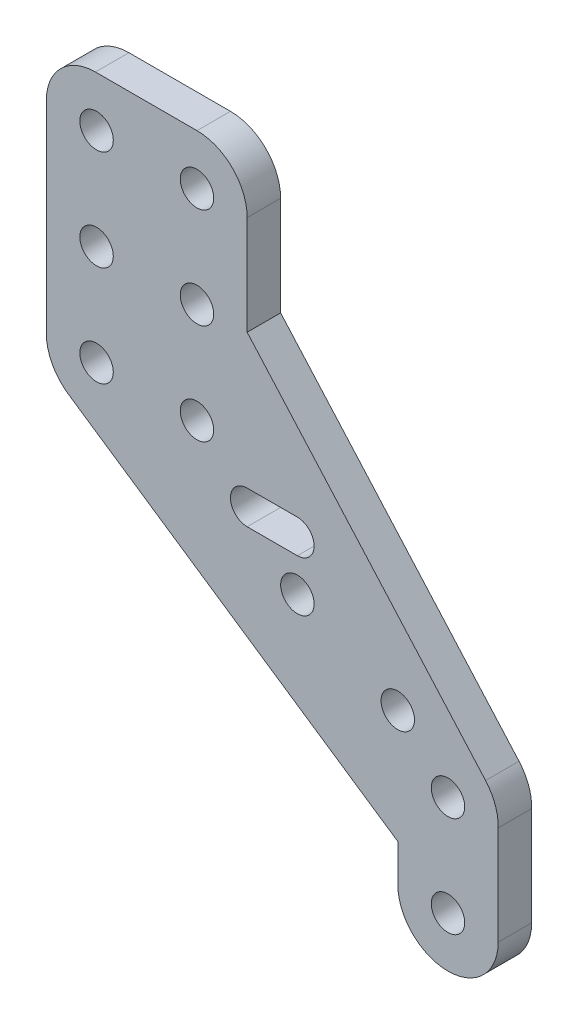
ISO-10303-21;
HEADER;
FILE_DESCRIPTION(('STEP AP214'),'2;1');
FILE_NAME('part.step','',(''),(''),'','','');
FILE_SCHEMA(('AUTOMOTIVE_DESIGN { 1 0 10303 214 1 1 1 1 }'));
ENDSEC;
DATA;
#1=APPLICATION_CONTEXT('core data for automotive mechanical design processes');
#2=APPLICATION_PROTOCOL_DEFINITION('international standard','automotive_design',2000,#1);
#3=PRODUCT_CONTEXT('',#1,'mechanical');
#4=PRODUCT('Part','Part','',(#3));
#5=PRODUCT_RELATED_PRODUCT_CATEGORY('part','',(#4));
#6=PRODUCT_DEFINITION_FORMATION('','',#4);
#7=PRODUCT_DEFINITION_CONTEXT('part definition',#1,'design');
#8=PRODUCT_DEFINITION('design','',#6,#7);
#9=PRODUCT_DEFINITION_SHAPE('','',#8);
#10=(LENGTH_UNIT() NAMED_UNIT(*) SI_UNIT(.MILLI.,.METRE.));
#11=(NAMED_UNIT(*) PLANE_ANGLE_UNIT() SI_UNIT($,.RADIAN.));
#12=(NAMED_UNIT(*) SI_UNIT($,.STERADIAN.) SOLID_ANGLE_UNIT());
#13=UNCERTAINTY_MEASURE_WITH_UNIT(LENGTH_MEASURE(1.E-05),#10,'distance_accuracy_value','');
#14=(GEOMETRIC_REPRESENTATION_CONTEXT(3) GLOBAL_UNCERTAINTY_ASSIGNED_CONTEXT((#13)) GLOBAL_UNIT_ASSIGNED_CONTEXT((#10,
#11,#12)) REPRESENTATION_CONTEXT('',''));
#15=CARTESIAN_POINT('',(0.,0.,0.));
#16=DIRECTION('',(0.,0.,1.));
#17=DIRECTION('',(1.,0.,0.));
#18=AXIS2_PLACEMENT_3D('',#15,#16,#17);
#19=CARTESIAN_POINT('',(79.4565649359122,0.,3.));
#20=DIRECTION('',(-1.,0.,0.));
#21=DIRECTION('',(0.,0.,1.));
#22=AXIS2_PLACEMENT_3D('',#19,#20,#21);
#23=PLANE('',#22);
#24=DIRECTION('',(0.,1.,0.));
#25=VECTOR('',#24,1.);
#26=CARTESIAN_POINT('',(79.4565649359122,0.,0.));
#27=LINE('',#26,#25);
#28=CARTESIAN_POINT('',(79.4565649359122,249.316156902,0.));
#29=VERTEX_POINT('',#28);
#30=CARTESIAN_POINT('',(79.4565649359122,252.639142715618,0.));
#31=VERTEX_POINT('',#30);
#32=EDGE_CURVE('E230',#29,#31,#27,.T.);
#33=ORIENTED_EDGE('',*,*,#32,.F.);
#34=DIRECTION('',(0.,0.,-1.));
#35=VECTOR('',#34,1.);
#36=CARTESIAN_POINT('',(79.4565649359122,249.316156902,3.));
#37=LINE('',#36,#35);
#38=CARTESIAN_POINT('',(79.4565649359122,249.316156902,3.));
#39=VERTEX_POINT('',#38);
#40=EDGE_CURVE('E11',#39,#29,#37,.T.);
#41=ORIENTED_EDGE('',*,*,#40,.F.);
#42=DIRECTION('',(0.,1.,0.));
#43=VECTOR('',#42,1.);
#44=CARTESIAN_POINT('',(79.4565649359122,0.,3.));
#45=LINE('',#44,#43);
#46=CARTESIAN_POINT('',(79.4565649359122,252.639142715618,3.));
#47=VERTEX_POINT('',#46);
#48=EDGE_CURVE('E338',#39,#47,#45,.T.);
#49=ORIENTED_EDGE('',*,*,#48,.T.);
#50=DIRECTION('',(0.,0.,-1.));
#51=VECTOR('',#50,1.);
#52=CARTESIAN_POINT('',(79.4565649359122,252.639142715618,3.));
#53=LINE('',#52,#51);
#54=EDGE_CURVE('E113',#47,#31,#53,.T.);
#55=ORIENTED_EDGE('',*,*,#54,.T.);
#56=EDGE_LOOP('',(#33,#41,#49,#55));
#57=FACE_BOUND('',#56,.T.);
#58=ADVANCED_FACE('F35',(#57),#23,.T.);
#59=CARTESIAN_POINT('',(83.9565649359122,249.316156902,3.));
#60=DIRECTION('',(0.,0.,-1.));
#61=DIRECTION('',(-1.,0.,0.));
#62=AXIS2_PLACEMENT_3D('',#59,#60,#61);
#63=CYLINDRICAL_SURFACE('',#62,4.5);
#64=CARTESIAN_POINT('',(83.9565649359122,249.316156902,0.));
#65=DIRECTION('',(0.,0.,1.));
#66=DIRECTION('',(1.,0.,0.));
#67=AXIS2_PLACEMENT_3D('',#64,#65,#66);
#68=CIRCLE('',#67,4.5);
#69=CARTESIAN_POINT('',(88.4565649359,249.316156902,0.));
#70=VERTEX_POINT('',#69);
#71=EDGE_CURVE('E232',#29,#70,#68,.T.);
#72=ORIENTED_EDGE('',*,*,#71,.T.);
#73=DIRECTION('',(0.,0.,-1.));
#74=VECTOR('',#73,1.);
#75=CARTESIAN_POINT('',(88.4565649359,249.316156902,3.));
#76=LINE('',#75,#74);
#77=CARTESIAN_POINT('',(88.4565649359,249.316156902,3.));
#78=VERTEX_POINT('',#77);
#79=EDGE_CURVE('E45',#78,#70,#76,.T.);
#80=ORIENTED_EDGE('',*,*,#79,.F.);
#81=CARTESIAN_POINT('',(83.9565649359122,249.316156902,3.));
#82=DIRECTION('',(0.,0.,1.));
#83=DIRECTION('',(1.,0.,0.));
#84=AXIS2_PLACEMENT_3D('',#81,#82,#83);
#85=CIRCLE('',#84,4.5);
#86=EDGE_CURVE('E340',#39,#78,#85,.T.);
#87=ORIENTED_EDGE('',*,*,#86,.F.);
#88=ORIENTED_EDGE('',*,*,#40,.T.);
#89=EDGE_LOOP('',(#72,#80,#87,#88));
#90=FACE_BOUND('',#89,.T.);
#91=ADVANCED_FACE('F377',(#90),#63,.T.);
#92=CARTESIAN_POINT('',(88.5141496779934,0.0204458570885828,3.));
#93=DIRECTION('',(0.99999997332188,0.000230989696195534,0.));
#94=DIRECTION('',(-0.000230989696195534,0.99999997332188,0.));
#95=AXIS2_PLACEMENT_3D('',#92,#93,#94);
#96=PLANE('',#95);
#97=DIRECTION('',(0.000230989696195534,-0.99999997332188,0.));
#98=VECTOR('',#97,1.);
#99=CARTESIAN_POINT('',(88.5141496779934,0.0204458570885828,0.));
#100=LINE('',#99,#98);
#101=CARTESIAN_POINT('',(88.4545173818,258.1804226208,0.));
#102=VERTEX_POINT('',#101);
#103=EDGE_CURVE('E235',#102,#70,#100,.T.);
#104=ORIENTED_EDGE('',*,*,#103,.F.);
#105=DIRECTION('',(0.,0.,-1.));
#106=VECTOR('',#105,1.);
#107=CARTESIAN_POINT('',(88.4545173818,258.1804226208,3.));
#108=LINE('',#107,#106);
#109=CARTESIAN_POINT('',(88.4545173818,258.1804226208,3.));
#110=VERTEX_POINT('',#109);
#111=EDGE_CURVE('E275',#110,#102,#108,.T.);
#112=ORIENTED_EDGE('',*,*,#111,.F.);
#113=DIRECTION('',(0.000230989696195534,-0.99999997332188,0.));
#114=VECTOR('',#113,1.);
#115=CARTESIAN_POINT('',(88.5141496779934,0.0204458570885828,3.));
#116=LINE('',#115,#114);
#117=EDGE_CURVE('E342',#110,#78,#116,.T.);
#118=ORIENTED_EDGE('',*,*,#117,.T.);
#119=ORIENTED_EDGE('',*,*,#79,.T.);
#120=EDGE_LOOP('',(#104,#112,#118,#119));
#121=FACE_BOUND('',#120,.T.);
#122=ADVANCED_FACE('F382',(#121),#96,.T.);
#123=CARTESIAN_POINT('',(83.9565649359758,258.316156902041,3.));
#124=DIRECTION('',(0.,0.,-1.));
#125=DIRECTION('',(-1.,0.,0.));
#126=AXIS2_PLACEMENT_3D('',#123,#124,#125);
#127=CYLINDRICAL_SURFACE('',#126,4.50000000000001);
#128=CARTESIAN_POINT('',(83.9565649359758,258.316156902041,0.));
#129=DIRECTION('',(0.,0.,1.));
#130=DIRECTION('',(1.,0.,0.));
#131=AXIS2_PLACEMENT_3D('',#128,#129,#130);
#132=CIRCLE('',#131,4.50000000000001);
#133=CARTESIAN_POINT('',(87.3246253296,261.3004774587,0.));
#134=VERTEX_POINT('',#133);
#135=EDGE_CURVE('E238',#102,#134,#132,.T.);
#136=ORIENTED_EDGE('',*,*,#135,.T.);
#137=DIRECTION('',(0.,0.,-1.));
#138=VECTOR('',#137,1.);
#139=CARTESIAN_POINT('',(87.3246253296,261.3004774587,3.));
#140=LINE('',#139,#138);
#141=CARTESIAN_POINT('',(87.3246253296,261.3004774587,3.));
#142=VERTEX_POINT('',#141);
#143=EDGE_CURVE('E272',#142,#134,#140,.T.);
#144=ORIENTED_EDGE('',*,*,#143,.F.);
#145=CARTESIAN_POINT('',(83.9565649359758,258.316156902041,3.));
#146=DIRECTION('',(0.,0.,1.));
#147=DIRECTION('',(1.,0.,0.));
#148=AXIS2_PLACEMENT_3D('',#145,#146,#147);
#149=CIRCLE('',#148,4.50000000000001);
#150=EDGE_CURVE('E345',#110,#142,#149,.T.);
#151=ORIENTED_EDGE('',*,*,#150,.F.);
#152=ORIENTED_EDGE('',*,*,#111,.T.);
#153=EDGE_LOOP('',(#136,#144,#151,#152));
#154=FACE_BOUND('',#153,.T.);
#155=ADVANCED_FACE('F585',(#154),#127,.T.);
#156=CARTESIAN_POINT('',(178.61847131618,158.267582362266,3.));
#157=DIRECTION('',(-0.748457865249174,-0.663182345925047,0.));
#158=DIRECTION('',(0.663182345925047,-0.748457865249174,0.));
#159=AXIS2_PLACEMENT_3D('',#156,#157,#158);
#160=PLANE('',#159);
#161=DIRECTION('',(-0.663182345925047,0.748457865249174,0.));
#162=VECTOR('',#161,1.);
#163=CARTESIAN_POINT('',(178.61847131618,158.267582362266,0.));
#164=LINE('',#163,#162);
#165=CARTESIAN_POINT('',(65.9565649359,285.416156902,0.));
#166=VERTEX_POINT('',#165);
#167=EDGE_CURVE('E241',#134,#166,#164,.T.);
#168=ORIENTED_EDGE('',*,*,#167,.T.);
#169=DIRECTION('',(0.,0.,-1.));
#170=VECTOR('',#169,1.);
#171=CARTESIAN_POINT('',(65.9565649359,285.416156902,3.));
#172=LINE('',#171,#170);
#173=CARTESIAN_POINT('',(65.9565649359,285.416156902,3.));
#174=VERTEX_POINT('',#173);
#175=EDGE_CURVE('E270',#174,#166,#172,.T.);
#176=ORIENTED_EDGE('',*,*,#175,.F.);
#177=DIRECTION('',(-0.663182345925047,0.748457865249174,0.));
#178=VECTOR('',#177,1.);
#179=CARTESIAN_POINT('',(178.61847131618,158.267582362266,3.));
#180=LINE('',#179,#178);
#181=EDGE_CURVE('E348',#142,#174,#180,.T.);
#182=ORIENTED_EDGE('',*,*,#181,.F.);
#183=ORIENTED_EDGE('',*,*,#143,.T.);
#184=EDGE_LOOP('',(#168,#176,#182,#183));
#185=FACE_BOUND('',#184,.T.);
#186=ADVANCED_FACE('F576',(#185),#160,.F.);
#187=CARTESIAN_POINT('',(65.9565649359,0.,3.));
#188=DIRECTION('',(1.,0.,0.));
#189=DIRECTION('',(0.,0.,-1.));
#190=AXIS2_PLACEMENT_3D('',#187,#188,#189);
#191=PLANE('',#190);
#192=DIRECTION('',(0.,-1.,0.));
#193=VECTOR('',#192,1.);
#194=CARTESIAN_POINT('',(65.9565649359,0.,0.));
#195=LINE('',#194,#193);
#196=CARTESIAN_POINT('',(65.9565649359,294.316156902,0.));
#197=VERTEX_POINT('',#196);
#198=EDGE_CURVE('E244',#197,#166,#195,.T.);
#199=ORIENTED_EDGE('',*,*,#198,.F.);
#200=DIRECTION('',(0.,0.,-1.));
#201=VECTOR('',#200,1.);
#202=CARTESIAN_POINT('',(65.9565649359,294.316156902,3.));
#203=LINE('',#202,#201);
#204=CARTESIAN_POINT('',(65.9565649359,294.316156902,3.));
#205=VERTEX_POINT('',#204);
#206=EDGE_CURVE('E268',#205,#197,#203,.T.);
#207=ORIENTED_EDGE('',*,*,#206,.F.);
#208=DIRECTION('',(0.,-1.,0.));
#209=VECTOR('',#208,1.);
#210=CARTESIAN_POINT('',(65.9565649359,0.,3.));
#211=LINE('',#210,#209);
#212=EDGE_CURVE('E350',#205,#174,#211,.T.);
#213=ORIENTED_EDGE('',*,*,#212,.T.);
#214=ORIENTED_EDGE('',*,*,#175,.T.);
#215=EDGE_LOOP('',(#199,#207,#213,#214));
#216=FACE_BOUND('',#215,.T.);
#217=ADVANCED_FACE('F568',(#216),#191,.T.);
#218=CARTESIAN_POINT('',(61.4565649359,294.316156902,3.));
#219=DIRECTION('',(0.,0.,-1.));
#220=DIRECTION('',(-1.,0.,0.));
#221=AXIS2_PLACEMENT_3D('',#218,#219,#220);
#222=CYLINDRICAL_SURFACE('',#221,4.5);
#223=CARTESIAN_POINT('',(61.4565649359,294.316156902,0.));
#224=DIRECTION('',(0.,0.,1.));
#225=DIRECTION('',(1.,0.,0.));
#226=AXIS2_PLACEMENT_3D('',#223,#224,#225);
#227=CIRCLE('',#226,4.5);
#228=CARTESIAN_POINT('',(61.4565649359,298.816156902,0.));
#229=VERTEX_POINT('',#228);
#230=EDGE_CURVE('E247',#197,#229,#227,.T.);
#231=ORIENTED_EDGE('',*,*,#230,.T.);
#232=DIRECTION('',(0.,0.,-1.));
#233=VECTOR('',#232,1.);
#234=CARTESIAN_POINT('',(61.4565649359,298.816156902,3.));
#235=LINE('',#234,#233);
#236=CARTESIAN_POINT('',(61.4565649359,298.816156902,3.));
#237=VERTEX_POINT('',#236);
#238=EDGE_CURVE('E266',#237,#229,#235,.T.);
#239=ORIENTED_EDGE('',*,*,#238,.F.);
#240=CARTESIAN_POINT('',(61.4565649359,294.316156902,3.));
#241=DIRECTION('',(0.,0.,1.));
#242=DIRECTION('',(1.,0.,0.));
#243=AXIS2_PLACEMENT_3D('',#240,#241,#242);
#244=CIRCLE('',#243,4.5);
#245=EDGE_CURVE('E353',#205,#237,#244,.T.);
#246=ORIENTED_EDGE('',*,*,#245,.F.);
#247=ORIENTED_EDGE('',*,*,#206,.T.);
#248=EDGE_LOOP('',(#231,#239,#246,#247));
#249=FACE_BOUND('',#248,.T.);
#250=ADVANCED_FACE('F362',(#249),#222,.T.);
#251=CARTESIAN_POINT('',(0.,298.816156902,3.));
#252=DIRECTION('',(0.,1.,0.));
#253=DIRECTION('',(0.,0.,1.));
#254=AXIS2_PLACEMENT_3D('',#251,#252,#253);
#255=PLANE('',#254);
#256=DIRECTION('',(1.,0.,0.));
#257=VECTOR('',#256,1.);
#258=CARTESIAN_POINT('',(0.,298.816156902,0.));
#259=LINE('',#258,#257);
#260=CARTESIAN_POINT('',(52.3565649359,298.816156902,0.));
#261=VERTEX_POINT('',#260);
#262=EDGE_CURVE('E250',#261,#229,#259,.T.);
#263=ORIENTED_EDGE('',*,*,#262,.F.);
#264=DIRECTION('',(0.,0.,-1.));
#265=VECTOR('',#264,1.);
#266=CARTESIAN_POINT('',(52.3565649359,298.816156902,3.));
#267=LINE('',#266,#265);
#268=CARTESIAN_POINT('',(52.3565649359,298.816156902,3.));
#269=VERTEX_POINT('',#268);
#270=EDGE_CURVE('E264',#269,#261,#267,.T.);
#271=ORIENTED_EDGE('',*,*,#270,.F.);
#272=DIRECTION('',(1.,0.,0.));
#273=VECTOR('',#272,1.);
#274=CARTESIAN_POINT('',(0.,298.816156902,3.));
#275=LINE('',#274,#273);
#276=EDGE_CURVE('E182',#269,#237,#275,.T.);
#277=ORIENTED_EDGE('',*,*,#276,.T.);
#278=ORIENTED_EDGE('',*,*,#238,.T.);
#279=EDGE_LOOP('',(#263,#271,#277,#278));
#280=FACE_BOUND('',#279,.T.);
#281=ADVANCED_FACE('F357',(#280),#255,.T.);
#282=CARTESIAN_POINT('',(52.3565649359001,294.416156902,3.));
#283=DIRECTION('',(0.,0.,-1.));
#284=DIRECTION('',(-1.,0.,0.));
#285=AXIS2_PLACEMENT_3D('',#282,#283,#284);
#286=CYLINDRICAL_SURFACE('',#285,4.40000000000007);
#287=CARTESIAN_POINT('',(52.3565649359001,294.416156902,0.));
#288=DIRECTION('',(0.,0.,1.));
#289=DIRECTION('',(1.,0.,0.));
#290=AXIS2_PLACEMENT_3D('',#287,#288,#289);
#291=CIRCLE('',#290,4.40000000000007);
#292=CARTESIAN_POINT('',(47.9565649359,294.416156902,0.));
#293=VERTEX_POINT('',#292);
#294=EDGE_CURVE('E253',#261,#293,#291,.T.);
#295=ORIENTED_EDGE('',*,*,#294,.T.);
#296=DIRECTION('',(0.,0.,-1.));
#297=VECTOR('',#296,1.);
#298=CARTESIAN_POINT('',(47.9565649359,294.416156902,3.));
#299=LINE('',#298,#297);
#300=CARTESIAN_POINT('',(47.9565649359,294.416156902,3.));
#301=VERTEX_POINT('',#300);
#302=EDGE_CURVE('E169',#301,#293,#299,.T.);
#303=ORIENTED_EDGE('',*,*,#302,.F.);
#304=CARTESIAN_POINT('',(52.3565649359001,294.416156902,3.));
#305=DIRECTION('',(0.,0.,1.));
#306=DIRECTION('',(1.,0.,0.));
#307=AXIS2_PLACEMENT_3D('',#304,#305,#306);
#308=CIRCLE('',#307,4.40000000000007);
#309=EDGE_CURVE('E179',#269,#301,#308,.T.);
#310=ORIENTED_EDGE('',*,*,#309,.F.);
#311=ORIENTED_EDGE('',*,*,#270,.T.);
#312=EDGE_LOOP('',(#295,#303,#310,#311));
#313=FACE_BOUND('',#312,.T.);
#314=ADVANCED_FACE('F367',(#313),#286,.T.);
#315=CARTESIAN_POINT('',(47.9565649359,0.,3.));
#316=DIRECTION('',(-1.,0.,0.));
#317=DIRECTION('',(0.,0.,1.));
#318=AXIS2_PLACEMENT_3D('',#315,#316,#317);
#319=PLANE('',#318);
#320=DIRECTION('',(0.,1.,0.));
#321=VECTOR('',#320,1.);
#322=CARTESIAN_POINT('',(47.9565649359,0.,0.));
#323=LINE('',#322,#321);
#324=CARTESIAN_POINT('',(47.9565649359,276.316156902,0.));
#325=VERTEX_POINT('',#324);
#326=EDGE_CURVE('E166',#325,#293,#323,.T.);
#327=ORIENTED_EDGE('',*,*,#326,.F.);
#328=DIRECTION('',(0.,0.,-1.));
#329=VECTOR('',#328,1.);
#330=CARTESIAN_POINT('',(47.9565649359,276.316156902,3.));
#331=LINE('',#330,#329);
#332=CARTESIAN_POINT('',(47.9565649359,276.316156902,3.));
#333=VERTEX_POINT('',#332);
#334=EDGE_CURVE('E160',#333,#325,#331,.T.);
#335=ORIENTED_EDGE('',*,*,#334,.F.);
#336=DIRECTION('',(0.,1.,0.));
#337=VECTOR('',#336,1.);
#338=CARTESIAN_POINT('',(47.9565649359,0.,3.));
#339=LINE('',#338,#337);
#340=EDGE_CURVE('E164',#333,#301,#339,.T.);
#341=ORIENTED_EDGE('',*,*,#340,.T.);
#342=ORIENTED_EDGE('',*,*,#302,.T.);
#343=EDGE_LOOP('',(#327,#335,#341,#342));
#344=FACE_BOUND('',#343,.T.);
#345=ADVANCED_FACE('F162',(#344),#319,.T.);
#346=CARTESIAN_POINT('',(52.456564935914,276.316156902,3.));
#347=DIRECTION('',(0.,0.,-1.));
#348=DIRECTION('',(-1.,0.,0.));
#349=AXIS2_PLACEMENT_3D('',#346,#347,#348);
#350=CYLINDRICAL_SURFACE('',#349,4.500000000014);
#351=CARTESIAN_POINT('',(52.456564935914,276.316156902,0.));
#352=DIRECTION('',(0.,0.,1.));
#353=DIRECTION('',(1.,0.,0.));
#354=AXIS2_PLACEMENT_3D('',#351,#352,#353);
#355=CIRCLE('',#354,4.500000000014);
#356=CARTESIAN_POINT('',(49.9369593248122,272.587673622618,0.));
#357=VERTEX_POINT('',#356);
#358=EDGE_CURVE('E257',#325,#357,#355,.T.);
#359=ORIENTED_EDGE('',*,*,#358,.T.);
#360=DIRECTION('',(0.,0.,-1.));
#361=VECTOR('',#360,1.);
#362=CARTESIAN_POINT('',(49.9369593248122,272.587673622618,3.));
#363=LINE('',#362,#361);
#364=CARTESIAN_POINT('',(49.9369593248122,272.587673622618,3.));
#365=VERTEX_POINT('',#364);
#366=EDGE_CURVE('E170',#365,#357,#363,.T.);
#367=ORIENTED_EDGE('',*,*,#366,.F.);
#368=CARTESIAN_POINT('',(52.456564935914,276.316156902,3.));
#369=DIRECTION('',(0.,0.,1.));
#370=DIRECTION('',(1.,0.,0.));
#371=AXIS2_PLACEMENT_3D('',#368,#369,#370);
#372=CIRCLE('',#371,4.500000000014);
#373=EDGE_CURVE('E173',#333,#365,#372,.T.);
#374=ORIENTED_EDGE('',*,*,#373,.F.);
#375=ORIENTED_EDGE('',*,*,#334,.T.);
#376=EDGE_LOOP('',(#359,#367,#374,#375));
#377=FACE_BOUND('',#376,.T.);
#378=ADVANCED_FACE('F174',(#377),#350,.T.);
#379=CARTESIAN_POINT('',(70.4565649359,271.816156902,3.));
#380=DIRECTION('',(0.,0.,-1.));
#381=DIRECTION('',(-1.,0.,0.));
#382=AXIS2_PLACEMENT_3D('',#379,#380,#381);
#383=CYLINDRICAL_SURFACE('',#382,1.5);
#384=CARTESIAN_POINT('',(70.4565649359,271.816156902,0.));
#385=DIRECTION('',(0.,0.,1.));
#386=DIRECTION('',(1.,0.,0.));
#387=AXIS2_PLACEMENT_3D('',#384,#385,#386);
#388=CIRCLE('',#387,1.5);
#389=CARTESIAN_POINT('',(70.4565649359,270.316156902,0.));
#390=VERTEX_POINT('',#389);
#391=CARTESIAN_POINT('',(70.4565649359,273.316156902,0.));
#392=VERTEX_POINT('',#391);
#393=EDGE_CURVE('E191',#390,#392,#388,.T.);
#394=ORIENTED_EDGE('',*,*,#393,.F.);
#395=DIRECTION('',(0.,0.,-1.));
#396=VECTOR('',#395,1.);
#397=CARTESIAN_POINT('',(70.4565649359,270.316156902,3.));
#398=LINE('',#397,#396);
#399=CARTESIAN_POINT('',(70.4565649359,270.316156902,3.));
#400=VERTEX_POINT('',#399);
#401=EDGE_CURVE('E39',#400,#390,#398,.T.);
#402=ORIENTED_EDGE('',*,*,#401,.F.);
#403=CARTESIAN_POINT('',(70.4565649359,271.816156902,3.));
#404=DIRECTION('',(0.,0.,1.));
#405=DIRECTION('',(1.,0.,0.));
#406=AXIS2_PLACEMENT_3D('',#403,#404,#405);
#407=CIRCLE('',#406,1.5);
#408=CARTESIAN_POINT('',(70.4565649359,273.316156902,3.));
#409=VERTEX_POINT('',#408);
#410=EDGE_CURVE('E308',#400,#409,#407,.T.);
#411=ORIENTED_EDGE('',*,*,#410,.T.);
#412=DIRECTION('',(0.,0.,-1.));
#413=VECTOR('',#412,1.);
#414=CARTESIAN_POINT('',(70.4565649359,273.316156902,3.));
#415=LINE('',#414,#413);
#416=EDGE_CURVE('E187',#409,#392,#415,.T.);
#417=ORIENTED_EDGE('',*,*,#416,.T.);
#418=EDGE_LOOP('',(#394,#402,#411,#417));
#419=FACE_BOUND('',#418,.T.);
#420=ADVANCED_FACE('F290',(#419),#383,.F.);
#421=CARTESIAN_POINT('',(0.,270.316156902,3.));
#422=DIRECTION('',(0.,1.,0.));
#423=DIRECTION('',(0.,0.,1.));
#424=AXIS2_PLACEMENT_3D('',#421,#422,#423);
#425=PLANE('',#424);
#426=DIRECTION('',(1.,0.,0.));
#427=VECTOR('',#426,1.);
#428=CARTESIAN_POINT('',(0.,270.316156902,0.));
#429=LINE('',#428,#427);
#430=CARTESIAN_POINT('',(65.9565649359,270.316156902,0.));
#431=VERTEX_POINT('',#430);
#432=EDGE_CURVE('E194',#431,#390,#429,.T.);
#433=ORIENTED_EDGE('',*,*,#432,.F.);
#434=DIRECTION('',(0.,0.,-1.));
#435=VECTOR('',#434,1.);
#436=CARTESIAN_POINT('',(65.9565649359,270.316156902,3.));
#437=LINE('',#436,#435);
#438=CARTESIAN_POINT('',(65.9565649359,270.316156902,3.));
#439=VERTEX_POINT('',#438);
#440=EDGE_CURVE('E280',#439,#431,#437,.T.);
#441=ORIENTED_EDGE('',*,*,#440,.F.);
#442=DIRECTION('',(1.,0.,0.));
#443=VECTOR('',#442,1.);
#444=CARTESIAN_POINT('',(0.,270.316156902,3.));
#445=LINE('',#444,#443);
#446=EDGE_CURVE('E289',#439,#400,#445,.T.);
#447=ORIENTED_EDGE('',*,*,#446,.T.);
#448=ORIENTED_EDGE('',*,*,#401,.T.);
#449=EDGE_LOOP('',(#433,#441,#447,#448));
#450=FACE_BOUND('',#449,.T.);
#451=ADVANCED_FACE('F287',(#450),#425,.T.);
#452=CARTESIAN_POINT('',(65.9565649359,271.816156902,3.));
#453=DIRECTION('',(0.,0.,-1.));
#454=DIRECTION('',(-1.,0.,0.));
#455=AXIS2_PLACEMENT_3D('',#452,#453,#454);
#456=CYLINDRICAL_SURFACE('',#455,1.5);
#457=CARTESIAN_POINT('',(65.9565649359,271.816156902,0.));
#458=DIRECTION('',(0.,0.,1.));
#459=DIRECTION('',(1.,0.,0.));
#460=AXIS2_PLACEMENT_3D('',#457,#458,#459);
#461=CIRCLE('',#460,1.5);
#462=CARTESIAN_POINT('',(65.9565649359,273.316156902,0.));
#463=VERTEX_POINT('',#462);
#464=EDGE_CURVE('E197',#463,#431,#461,.T.);
#465=ORIENTED_EDGE('',*,*,#464,.F.);
#466=DIRECTION('',(0.,0.,-1.));
#467=VECTOR('',#466,1.);
#468=CARTESIAN_POINT('',(65.9565649359,273.316156902,3.));
#469=LINE('',#468,#467);
#470=CARTESIAN_POINT('',(65.9565649359,273.316156902,3.));
#471=VERTEX_POINT('',#470);
#472=EDGE_CURVE('E279',#471,#463,#469,.T.);
#473=ORIENTED_EDGE('',*,*,#472,.F.);
#474=CARTESIAN_POINT('',(65.9565649359,271.816156902,3.));
#475=DIRECTION('',(0.,0.,1.));
#476=DIRECTION('',(1.,0.,0.));
#477=AXIS2_PLACEMENT_3D('',#474,#475,#476);
#478=CIRCLE('',#477,1.5);
#479=EDGE_CURVE('E299',#471,#439,#478,.T.);
#480=ORIENTED_EDGE('',*,*,#479,.T.);
#481=ORIENTED_EDGE('',*,*,#440,.T.);
#482=EDGE_LOOP('',(#465,#473,#480,#481));
#483=FACE_BOUND('',#482,.T.);
#484=ADVANCED_FACE('F296',(#483),#456,.F.);
#485=CARTESIAN_POINT('',(70.4565649359,267.316156902,3.));
#486=DIRECTION('',(0.,0.,-1.));
#487=DIRECTION('',(-1.,0.,0.));
#488=AXIS2_PLACEMENT_3D('',#485,#486,#487);
#489=CYLINDRICAL_SURFACE('',#488,1.5);
#490=CARTESIAN_POINT('',(70.4565649359,267.316156902,3.));
#491=DIRECTION('',(0.,0.,1.));
#492=DIRECTION('',(1.,0.,0.));
#493=AXIS2_PLACEMENT_3D('',#490,#491,#492);
#494=CIRCLE('',#493,1.5);
#495=CARTESIAN_POINT('',(71.9565649359,267.316156902,3.));
#496=VERTEX_POINT('',#495);
#497=EDGE_CURVE('E335',#496,#496,#494,.T.);
#498=ORIENTED_EDGE('',*,*,#497,.T.);
#499=EDGE_LOOP('',(#498));
#500=FACE_BOUND('',#499,.T.);
#501=CARTESIAN_POINT('',(70.4565649359,267.316156902,0.));
#502=DIRECTION('',(0.,0.,1.));
#503=DIRECTION('',(1.,0.,0.));
#504=AXIS2_PLACEMENT_3D('',#501,#502,#503);
#505=CIRCLE('',#504,1.5);
#506=CARTESIAN_POINT('',(71.9565649359,267.316156902,0.));
#507=VERTEX_POINT('',#506);
#508=EDGE_CURVE('E227',#507,#507,#505,.T.);
#509=ORIENTED_EDGE('',*,*,#508,.F.);
#510=EDGE_LOOP('',(#509));
#511=FACE_BOUND('',#510,.T.);
#512=ADVANCED_FACE('F387',(#500,#511),#489,.F.);
#513=CARTESIAN_POINT('',(83.9565649359758,258.316156902041,3.));
#514=DIRECTION('',(0.,0.,-1.));
#515=DIRECTION('',(-1.,0.,0.));
#516=AXIS2_PLACEMENT_3D('',#513,#514,#515);
#517=CYLINDRICAL_SURFACE('',#516,1.49999999992423);
#518=CARTESIAN_POINT('',(83.9565649359758,258.316156902041,3.));
#519=DIRECTION('',(0.,0.,1.));
#520=DIRECTION('',(1.,0.,0.));
#521=AXIS2_PLACEMENT_3D('',#518,#519,#520);
#522=CIRCLE('',#521,1.49999999992423);
#523=CARTESIAN_POINT('',(85.4565649359,258.316156902041,3.));
#524=VERTEX_POINT('',#523);
#525=EDGE_CURVE('E332',#524,#524,#522,.T.);
#526=ORIENTED_EDGE('',*,*,#525,.T.);
#527=EDGE_LOOP('',(#526));
#528=FACE_BOUND('',#527,.T.);
#529=CARTESIAN_POINT('',(83.9565649359758,258.316156902041,0.));
#530=DIRECTION('',(0.,0.,1.));
#531=DIRECTION('',(1.,0.,0.));
#532=AXIS2_PLACEMENT_3D('',#529,#530,#531);
#533=CIRCLE('',#532,1.49999999992423);
#534=CARTESIAN_POINT('',(85.4565649359,258.316156902041,0.));
#535=VERTEX_POINT('',#534);
#536=EDGE_CURVE('E224',#535,#535,#533,.T.);
#537=ORIENTED_EDGE('',*,*,#536,.F.);
#538=EDGE_LOOP('',(#537));
#539=FACE_BOUND('',#538,.T.);
#540=ADVANCED_FACE('F390',(#528,#539),#517,.F.);
#541=CARTESIAN_POINT('',(61.4565649359,276.316156902,3.));
#542=DIRECTION('',(0.,0.,-1.));
#543=DIRECTION('',(-1.,0.,0.));
#544=AXIS2_PLACEMENT_3D('',#541,#542,#543);
#545=CYLINDRICAL_SURFACE('',#544,1.5);
#546=CARTESIAN_POINT('',(61.4565649359,276.316156902,3.));
#547=DIRECTION('',(0.,0.,1.));
#548=DIRECTION('',(1.,0.,0.));
#549=AXIS2_PLACEMENT_3D('',#546,#547,#548);
#550=CIRCLE('',#549,1.5);
#551=CARTESIAN_POINT('',(62.9565649359,276.316156902,3.));
#552=VERTEX_POINT('',#551);
#553=EDGE_CURVE('E329',#552,#552,#550,.T.);
#554=ORIENTED_EDGE('',*,*,#553,.T.);
#555=EDGE_LOOP('',(#554));
#556=FACE_BOUND('',#555,.T.);
#557=CARTESIAN_POINT('',(61.4565649359,276.316156902,0.));
#558=DIRECTION('',(0.,0.,1.));
#559=DIRECTION('',(1.,0.,0.));
#560=AXIS2_PLACEMENT_3D('',#557,#558,#559);
#561=CIRCLE('',#560,1.5);
#562=CARTESIAN_POINT('',(62.9565649359,276.316156902,0.));
#563=VERTEX_POINT('',#562);
#564=EDGE_CURVE('E221',#563,#563,#561,.T.);
#565=ORIENTED_EDGE('',*,*,#564,.F.);
#566=EDGE_LOOP('',(#565));
#567=FACE_BOUND('',#566,.T.);
#568=ADVANCED_FACE('F394',(#556,#567),#545,.F.);
#569=CARTESIAN_POINT('',(61.4565649359,285.316156902,3.));
#570=DIRECTION('',(0.,0.,-1.));
#571=DIRECTION('',(-1.,0.,0.));
#572=AXIS2_PLACEMENT_3D('',#569,#570,#571);
#573=CYLINDRICAL_SURFACE('',#572,1.5);
#574=CARTESIAN_POINT('',(61.4565649359,285.316156902,3.));
#575=DIRECTION('',(0.,0.,1.));
#576=DIRECTION('',(1.,0.,0.));
#577=AXIS2_PLACEMENT_3D('',#574,#575,#576);
#578=CIRCLE('',#577,1.5);
#579=CARTESIAN_POINT('',(62.9565649359,285.316156902,3.));
#580=VERTEX_POINT('',#579);
#581=EDGE_CURVE('E326',#580,#580,#578,.T.);
#582=ORIENTED_EDGE('',*,*,#581,.T.);
#583=EDGE_LOOP('',(#582));
#584=FACE_BOUND('',#583,.T.);
#585=CARTESIAN_POINT('',(61.4565649359,285.316156902,0.));
#586=DIRECTION('',(0.,0.,1.));
#587=DIRECTION('',(1.,0.,0.));
#588=AXIS2_PLACEMENT_3D('',#585,#586,#587);
#589=CIRCLE('',#588,1.5);
#590=CARTESIAN_POINT('',(62.9565649359,285.316156902,0.));
#591=VERTEX_POINT('',#590);
#592=EDGE_CURVE('E218',#591,#591,#589,.T.);
#593=ORIENTED_EDGE('',*,*,#592,.F.);
#594=EDGE_LOOP('',(#593));
#595=FACE_BOUND('',#594,.T.);
#596=ADVANCED_FACE('F398',(#584,#595),#573,.F.);
#597=CARTESIAN_POINT('',(61.4565649359,294.316156902,3.));
#598=DIRECTION('',(0.,0.,-1.));
#599=DIRECTION('',(-1.,0.,0.));
#600=AXIS2_PLACEMENT_3D('',#597,#598,#599);
#601=CYLINDRICAL_SURFACE('',#600,1.5);
#602=CARTESIAN_POINT('',(61.4565649359,294.316156902,3.));
#603=DIRECTION('',(0.,0.,1.));
#604=DIRECTION('',(1.,0.,0.));
#605=AXIS2_PLACEMENT_3D('',#602,#603,#604);
#606=CIRCLE('',#605,1.5);
#607=CARTESIAN_POINT('',(62.9565649359,294.316156902,3.));
#608=VERTEX_POINT('',#607);
#609=EDGE_CURVE('E323',#608,#608,#606,.T.);
#610=ORIENTED_EDGE('',*,*,#609,.T.);
#611=EDGE_LOOP('',(#610));
#612=FACE_BOUND('',#611,.T.);
#613=CARTESIAN_POINT('',(61.4565649359,294.316156902,0.));
#614=DIRECTION('',(0.,0.,1.));
#615=DIRECTION('',(1.,0.,0.));
#616=AXIS2_PLACEMENT_3D('',#613,#614,#615);
#617=CIRCLE('',#616,1.5);
#618=CARTESIAN_POINT('',(62.9565649359,294.316156902,0.));
#619=VERTEX_POINT('',#618);
#620=EDGE_CURVE('E215',#619,#619,#617,.T.);
#621=ORIENTED_EDGE('',*,*,#620,.F.);
#622=EDGE_LOOP('',(#621));
#623=FACE_BOUND('',#622,.T.);
#624=ADVANCED_FACE('F402',(#612,#623),#601,.F.);
#625=CARTESIAN_POINT('',(83.9565649359122,249.316156902,3.));
#626=DIRECTION('',(0.,0.,-1.));
#627=DIRECTION('',(-1.,0.,0.));
#628=AXIS2_PLACEMENT_3D('',#625,#626,#627);
#629=CYLINDRICAL_SURFACE('',#628,1.49999999998779);
#630=CARTESIAN_POINT('',(83.9565649359122,249.316156902,3.));
#631=DIRECTION('',(0.,0.,1.));
#632=DIRECTION('',(1.,0.,0.));
#633=AXIS2_PLACEMENT_3D('',#630,#631,#632);
#634=CIRCLE('',#633,1.49999999998779);
#635=CARTESIAN_POINT('',(85.4565649359,249.316156902,3.));
#636=VERTEX_POINT('',#635);
#637=EDGE_CURVE('E320',#636,#636,#634,.T.);
#638=ORIENTED_EDGE('',*,*,#637,.T.);
#639=EDGE_LOOP('',(#638));
#640=FACE_BOUND('',#639,.T.);
#641=CARTESIAN_POINT('',(83.9565649359122,249.316156902,0.));
#642=DIRECTION('',(0.,0.,1.));
#643=DIRECTION('',(1.,0.,0.));
#644=AXIS2_PLACEMENT_3D('',#641,#642,#643);
#645=CIRCLE('',#644,1.49999999998779);
#646=CARTESIAN_POINT('',(85.4565649359,249.316156902,0.));
#647=VERTEX_POINT('',#646);
#648=EDGE_CURVE('E212',#647,#647,#645,.T.);
#649=ORIENTED_EDGE('',*,*,#648,.F.);
#650=EDGE_LOOP('',(#649));
#651=FACE_BOUND('',#650,.T.);
#652=ADVANCED_FACE('F406',(#640,#651),#629,.F.);
#653=CARTESIAN_POINT('',(52.4565649359,294.316156902,3.));
#654=DIRECTION('',(0.,0.,-1.));
#655=DIRECTION('',(-1.,0.,0.));
#656=AXIS2_PLACEMENT_3D('',#653,#654,#655);
#657=CYLINDRICAL_SURFACE('',#656,1.5);
#658=CARTESIAN_POINT('',(52.4565649359,294.316156902,3.));
#659=DIRECTION('',(0.,0.,1.));
#660=DIRECTION('',(1.,0.,0.));
#661=AXIS2_PLACEMENT_3D('',#658,#659,#660);
#662=CIRCLE('',#661,1.5);
#663=CARTESIAN_POINT('',(53.9565649359,294.316156902,3.));
#664=VERTEX_POINT('',#663);
#665=EDGE_CURVE('E317',#664,#664,#662,.T.);
#666=ORIENTED_EDGE('',*,*,#665,.T.);
#667=EDGE_LOOP('',(#666));
#668=FACE_BOUND('',#667,.T.);
#669=CARTESIAN_POINT('',(52.4565649359,294.316156902,0.));
#670=DIRECTION('',(0.,0.,1.));
#671=DIRECTION('',(1.,0.,0.));
#672=AXIS2_PLACEMENT_3D('',#669,#670,#671);
#673=CIRCLE('',#672,1.5);
#674=CARTESIAN_POINT('',(53.9565649359,294.316156902,0.));
#675=VERTEX_POINT('',#674);
#676=EDGE_CURVE('E209',#675,#675,#673,.T.);
#677=ORIENTED_EDGE('',*,*,#676,.F.);
#678=EDGE_LOOP('',(#677));
#679=FACE_BOUND('',#678,.T.);
#680=ADVANCED_FACE('F410',(#668,#679),#657,.F.);
#681=CARTESIAN_POINT('',(52.456564935914,276.316156902,3.));
#682=DIRECTION('',(0.,0.,-1.));
#683=DIRECTION('',(-1.,0.,0.));
#684=AXIS2_PLACEMENT_3D('',#681,#682,#683);
#685=CYLINDRICAL_SURFACE('',#684,1.499999999986);
#686=CARTESIAN_POINT('',(52.456564935914,276.316156902,3.));
#687=DIRECTION('',(0.,0.,1.));
#688=DIRECTION('',(1.,0.,0.));
#689=AXIS2_PLACEMENT_3D('',#686,#687,#688);
#690=CIRCLE('',#689,1.499999999986);
#691=CARTESIAN_POINT('',(53.9565649359,276.316156902,3.));
#692=VERTEX_POINT('',#691);
#693=EDGE_CURVE('E314',#692,#692,#690,.T.);
#694=ORIENTED_EDGE('',*,*,#693,.T.);
#695=EDGE_LOOP('',(#694));
#696=FACE_BOUND('',#695,.T.);
#697=CARTESIAN_POINT('',(52.456564935914,276.316156902,0.));
#698=DIRECTION('',(0.,0.,1.));
#699=DIRECTION('',(1.,0.,0.));
#700=AXIS2_PLACEMENT_3D('',#697,#698,#699);
#701=CIRCLE('',#700,1.499999999986);
#702=CARTESIAN_POINT('',(53.9565649359,276.316156902,0.));
#703=VERTEX_POINT('',#702);
#704=EDGE_CURVE('E206',#703,#703,#701,.T.);
#705=ORIENTED_EDGE('',*,*,#704,.F.);
#706=EDGE_LOOP('',(#705));
#707=FACE_BOUND('',#706,.T.);
#708=ADVANCED_FACE('F414',(#696,#707),#685,.F.);
#709=CARTESIAN_POINT('',(52.4565649359,285.316156902,3.));
#710=DIRECTION('',(0.,0.,-1.));
#711=DIRECTION('',(-1.,0.,0.));
#712=AXIS2_PLACEMENT_3D('',#709,#710,#711);
#713=CYLINDRICAL_SURFACE('',#712,1.5);
#714=CARTESIAN_POINT('',(52.4565649359,285.316156902,3.));
#715=DIRECTION('',(0.,0.,1.));
#716=DIRECTION('',(1.,0.,0.));
#717=AXIS2_PLACEMENT_3D('',#714,#715,#716);
#718=CIRCLE('',#717,1.5);
#719=CARTESIAN_POINT('',(53.9565649359,285.316156902,3.));
#720=VERTEX_POINT('',#719);
#721=EDGE_CURVE('E304',#720,#720,#718,.T.);
#722=ORIENTED_EDGE('',*,*,#721,.T.);
#723=EDGE_LOOP('',(#722));
#724=FACE_BOUND('',#723,.T.);
#725=CARTESIAN_POINT('',(52.4565649359,285.316156902,0.));
#726=DIRECTION('',(0.,0.,1.));
#727=DIRECTION('',(1.,0.,0.));
#728=AXIS2_PLACEMENT_3D('',#725,#726,#727);
#729=CIRCLE('',#728,1.5);
#730=CARTESIAN_POINT('',(53.9565649359,285.316156902,0.));
#731=VERTEX_POINT('',#730);
#732=EDGE_CURVE('E203',#731,#731,#729,.T.);
#733=ORIENTED_EDGE('',*,*,#732,.F.);
#734=EDGE_LOOP('',(#733));
#735=FACE_BOUND('',#734,.T.);
#736=ADVANCED_FACE('F418',(#724,#735),#713,.F.);
#737=CARTESIAN_POINT('',(0.,273.316156902,3.));
#738=DIRECTION('',(0.,1.,0.));
#739=DIRECTION('',(0.,0.,1.));
#740=AXIS2_PLACEMENT_3D('',#737,#738,#739);
#741=PLANE('',#740);
#742=DIRECTION('',(1.,0.,0.));
#743=VECTOR('',#742,1.);
#744=CARTESIAN_POINT('',(0.,273.316156902,0.));
#745=LINE('',#744,#743);
#746=EDGE_CURVE('E200',#463,#392,#745,.T.);
#747=ORIENTED_EDGE('',*,*,#746,.T.);
#748=ORIENTED_EDGE('',*,*,#416,.F.);
#749=DIRECTION('',(1.,0.,0.));
#750=VECTOR('',#749,1.);
#751=CARTESIAN_POINT('',(0.,273.316156902,3.));
#752=LINE('',#751,#750);
#753=EDGE_CURVE('E301',#471,#409,#752,.T.);
#754=ORIENTED_EDGE('',*,*,#753,.F.);
#755=ORIENTED_EDGE('',*,*,#472,.T.);
#756=EDGE_LOOP('',(#747,#748,#754,#755));
#757=FACE_BOUND('',#756,.T.);
#758=ADVANCED_FACE('F302',(#757),#741,.F.);
#759=CARTESIAN_POINT('',(79.4565649359,262.816156902,3.));
#760=DIRECTION('',(0.,0.,-1.));
#761=DIRECTION('',(-1.,0.,0.));
#762=AXIS2_PLACEMENT_3D('',#759,#760,#761);
#763=CYLINDRICAL_SURFACE('',#762,1.5);
#764=CARTESIAN_POINT('',(79.4565649359,262.816156902,3.));
#765=DIRECTION('',(0.,0.,1.));
#766=DIRECTION('',(1.,0.,0.));
#767=AXIS2_PLACEMENT_3D('',#764,#765,#766);
#768=CIRCLE('',#767,1.5);
#769=CARTESIAN_POINT('',(80.9565649359,262.816156902,3.));
#770=VERTEX_POINT('',#769);
#771=EDGE_CURVE('E260',#770,#770,#768,.T.);
#772=ORIENTED_EDGE('',*,*,#771,.T.);
#773=EDGE_LOOP('',(#772));
#774=FACE_BOUND('',#773,.T.);
#775=CARTESIAN_POINT('',(79.4565649359,262.816156902,0.));
#776=DIRECTION('',(0.,0.,1.));
#777=DIRECTION('',(1.,0.,0.));
#778=AXIS2_PLACEMENT_3D('',#775,#776,#777);
#779=CIRCLE('',#778,1.5);
#780=CARTESIAN_POINT('',(80.9565649359,262.816156902,0.));
#781=VERTEX_POINT('',#780);
#782=EDGE_CURVE('E188',#781,#781,#779,.T.);
#783=ORIENTED_EDGE('',*,*,#782,.F.);
#784=EDGE_LOOP('',(#783));
#785=FACE_BOUND('',#784,.T.);
#786=ADVANCED_FACE('F37',(#774,#785),#763,.F.);
#787=CARTESIAN_POINT('',(142.113225220891,210.297509135306,3.));
#788=DIRECTION('',(0.559912358018758,0.828551839861498,0.));
#789=DIRECTION('',(-0.828551839861498,0.559912358018758,0.));
#790=AXIS2_PLACEMENT_3D('',#787,#788,#789);
#791=PLANE('',#790);
#792=DIRECTION('',(0.828551839861498,-0.559912358018758,0.));
#793=VECTOR('',#792,1.);
#794=CARTESIAN_POINT('',(142.113225220891,210.297509135306,0.));
#795=LINE('',#794,#793);
#796=EDGE_CURVE('E106',#357,#31,#795,.T.);
#797=ORIENTED_EDGE('',*,*,#796,.T.);
#798=ORIENTED_EDGE('',*,*,#54,.F.);
#799=DIRECTION('',(0.828551839861498,-0.559912358018758,0.));
#800=VECTOR('',#799,1.);
#801=CARTESIAN_POINT('',(142.113225220891,210.297509135306,3.));
#802=LINE('',#801,#800);
#803=EDGE_CURVE('E54',#365,#47,#802,.T.);
#804=ORIENTED_EDGE('',*,*,#803,.F.);
#805=ORIENTED_EDGE('',*,*,#366,.T.);
#806=EDGE_LOOP('',(#797,#798,#804,#805));
#807=FACE_BOUND('',#806,.T.);
#808=ADVANCED_FACE('F436',(#807),#791,.F.);
#809=CARTESIAN_POINT('',(0.,0.,3.));
#810=DIRECTION('',(0.,0.,1.));
#811=DIRECTION('',(1.,0.,0.));
#812=AXIS2_PLACEMENT_3D('',#809,#810,#811);
#813=PLANE('',#812);
#814=ORIENTED_EDGE('',*,*,#771,.F.);
#815=EDGE_LOOP('',(#814));
#816=FACE_BOUND('',#815,.T.);
#817=ORIENTED_EDGE('',*,*,#410,.F.);
#818=ORIENTED_EDGE('',*,*,#446,.F.);
#819=ORIENTED_EDGE('',*,*,#479,.F.);
#820=ORIENTED_EDGE('',*,*,#753,.T.);
#821=EDGE_LOOP('',(#817,#818,#819,#820));
#822=FACE_BOUND('',#821,.T.);
#823=ORIENTED_EDGE('',*,*,#721,.F.);
#824=EDGE_LOOP('',(#823));
#825=FACE_BOUND('',#824,.T.);
#826=ORIENTED_EDGE('',*,*,#693,.F.);
#827=EDGE_LOOP('',(#826));
#828=FACE_BOUND('',#827,.T.);
#829=ORIENTED_EDGE('',*,*,#665,.F.);
#830=EDGE_LOOP('',(#829));
#831=FACE_BOUND('',#830,.T.);
#832=ORIENTED_EDGE('',*,*,#637,.F.);
#833=EDGE_LOOP('',(#832));
#834=FACE_BOUND('',#833,.T.);
#835=ORIENTED_EDGE('',*,*,#609,.F.);
#836=EDGE_LOOP('',(#835));
#837=FACE_BOUND('',#836,.T.);
#838=ORIENTED_EDGE('',*,*,#581,.F.);
#839=EDGE_LOOP('',(#838));
#840=FACE_BOUND('',#839,.T.);
#841=ORIENTED_EDGE('',*,*,#553,.F.);
#842=EDGE_LOOP('',(#841));
#843=FACE_BOUND('',#842,.T.);
#844=ORIENTED_EDGE('',*,*,#525,.F.);
#845=EDGE_LOOP('',(#844));
#846=FACE_BOUND('',#845,.T.);
#847=ORIENTED_EDGE('',*,*,#497,.F.);
#848=EDGE_LOOP('',(#847));
#849=FACE_BOUND('',#848,.T.);
#850=ORIENTED_EDGE('',*,*,#48,.F.);
#851=ORIENTED_EDGE('',*,*,#86,.T.);
#852=ORIENTED_EDGE('',*,*,#117,.F.);
#853=ORIENTED_EDGE('',*,*,#150,.T.);
#854=ORIENTED_EDGE('',*,*,#181,.T.);
#855=ORIENTED_EDGE('',*,*,#212,.F.);
#856=ORIENTED_EDGE('',*,*,#245,.T.);
#857=ORIENTED_EDGE('',*,*,#276,.F.);
#858=ORIENTED_EDGE('',*,*,#309,.T.);
#859=ORIENTED_EDGE('',*,*,#340,.F.);
#860=ORIENTED_EDGE('',*,*,#373,.T.);
#861=ORIENTED_EDGE('',*,*,#803,.T.);
#862=EDGE_LOOP('',(#850,#851,#852,#853,#854,#855,#856,#857,#858,#859,#860,#861));
#863=FACE_BOUND('',#862,.T.);
#864=ADVANCED_FACE('F176',(#816,#822,#825,#828,#831,#834,#837,#840,#843,#846,#849,#863),#813,.T.);
#865=CARTESIAN_POINT('',(0.,0.,0.));
#866=DIRECTION('',(0.,0.,1.));
#867=DIRECTION('',(1.,0.,0.));
#868=AXIS2_PLACEMENT_3D('',#865,#866,#867);
#869=PLANE('',#868);
#870=ORIENTED_EDGE('',*,*,#782,.T.);
#871=EDGE_LOOP('',(#870));
#872=FACE_BOUND('',#871,.T.);
#873=ORIENTED_EDGE('',*,*,#393,.T.);
#874=ORIENTED_EDGE('',*,*,#746,.F.);
#875=ORIENTED_EDGE('',*,*,#464,.T.);
#876=ORIENTED_EDGE('',*,*,#432,.T.);
#877=EDGE_LOOP('',(#873,#874,#875,#876));
#878=FACE_BOUND('',#877,.T.);
#879=ORIENTED_EDGE('',*,*,#732,.T.);
#880=EDGE_LOOP('',(#879));
#881=FACE_BOUND('',#880,.T.);
#882=ORIENTED_EDGE('',*,*,#704,.T.);
#883=EDGE_LOOP('',(#882));
#884=FACE_BOUND('',#883,.T.);
#885=ORIENTED_EDGE('',*,*,#676,.T.);
#886=EDGE_LOOP('',(#885));
#887=FACE_BOUND('',#886,.T.);
#888=ORIENTED_EDGE('',*,*,#648,.T.);
#889=EDGE_LOOP('',(#888));
#890=FACE_BOUND('',#889,.T.);
#891=ORIENTED_EDGE('',*,*,#620,.T.);
#892=EDGE_LOOP('',(#891));
#893=FACE_BOUND('',#892,.T.);
#894=ORIENTED_EDGE('',*,*,#592,.T.);
#895=EDGE_LOOP('',(#894));
#896=FACE_BOUND('',#895,.T.);
#897=ORIENTED_EDGE('',*,*,#564,.T.);
#898=EDGE_LOOP('',(#897));
#899=FACE_BOUND('',#898,.T.);
#900=ORIENTED_EDGE('',*,*,#536,.T.);
#901=EDGE_LOOP('',(#900));
#902=FACE_BOUND('',#901,.T.);
#903=ORIENTED_EDGE('',*,*,#508,.T.);
#904=EDGE_LOOP('',(#903));
#905=FACE_BOUND('',#904,.T.);
#906=ORIENTED_EDGE('',*,*,#32,.T.);
#907=ORIENTED_EDGE('',*,*,#796,.F.);
#908=ORIENTED_EDGE('',*,*,#358,.F.);
#909=ORIENTED_EDGE('',*,*,#326,.T.);
#910=ORIENTED_EDGE('',*,*,#294,.F.);
#911=ORIENTED_EDGE('',*,*,#262,.T.);
#912=ORIENTED_EDGE('',*,*,#230,.F.);
#913=ORIENTED_EDGE('',*,*,#198,.T.);
#914=ORIENTED_EDGE('',*,*,#167,.F.);
#915=ORIENTED_EDGE('',*,*,#135,.F.);
#916=ORIENTED_EDGE('',*,*,#103,.T.);
#917=ORIENTED_EDGE('',*,*,#71,.F.);
#918=EDGE_LOOP('',(#906,#907,#908,#909,#910,#911,#912,#913,#914,#915,#916,#917));
#919=FACE_BOUND('',#918,.T.);
#920=ADVANCED_FACE('F294',(#872,#878,#881,#884,#887,#890,#893,#896,#899,#902,#905,#919),#869,.F.);
#921=CLOSED_SHELL('',(#58,#91,#122,#155,#186,#217,#250,#281,#314,#345,#378,#420,#451,#484,#512,
#540,#568,#596,#624,#652,#680,#708,#736,#758,#786,#808,#864,#920));
#922=MANIFOLD_SOLID_BREP('B2',#921);
#923=ADVANCED_BREP_SHAPE_REPRESENTATION('',(#18,#922),#14);
#924=SHAPE_DEFINITION_REPRESENTATION(#9,#923);
ENDSEC;
END-ISO-10303-21;
